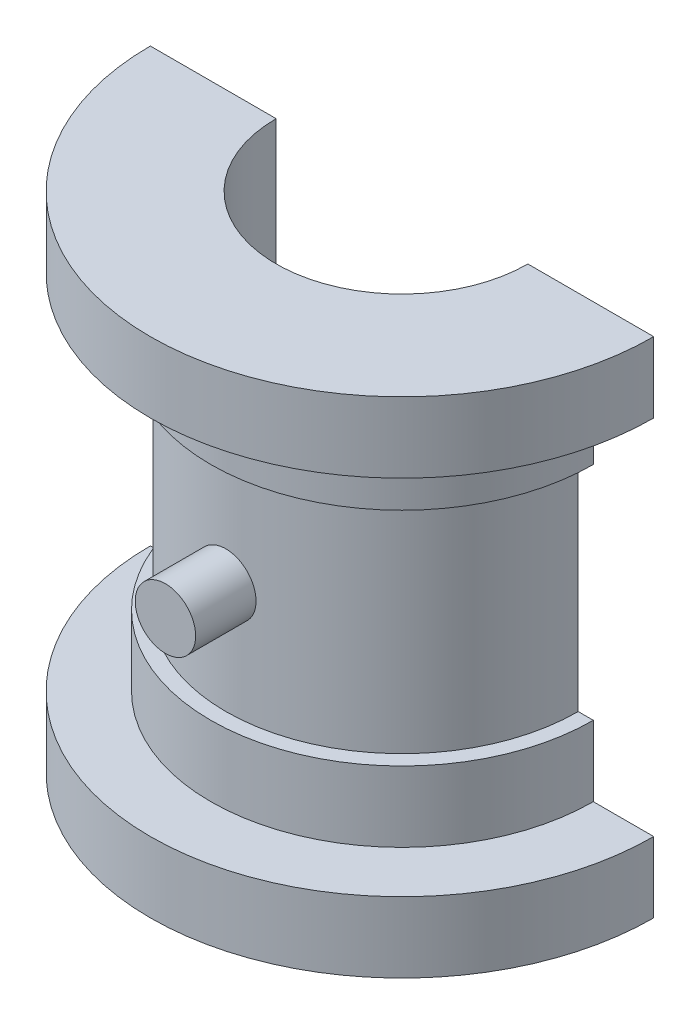
ISO-10303-21;
HEADER;
FILE_DESCRIPTION(('STEP AP214'),'2;1');
FILE_NAME('part.step','',(''),(''),'','','');
FILE_SCHEMA(('AUTOMOTIVE_DESIGN { 1 0 10303 214 1 1 1 1 }'));
ENDSEC;
DATA;
#1=APPLICATION_CONTEXT('core data for automotive mechanical design processes');
#2=APPLICATION_PROTOCOL_DEFINITION('international standard','automotive_design',2000,#1);
#3=PRODUCT_CONTEXT('',#1,'mechanical');
#4=PRODUCT('Part','Part','',(#3));
#5=PRODUCT_RELATED_PRODUCT_CATEGORY('part','',(#4));
#6=PRODUCT_DEFINITION_FORMATION('','',#4);
#7=PRODUCT_DEFINITION_CONTEXT('part definition',#1,'design');
#8=PRODUCT_DEFINITION('design','',#6,#7);
#9=PRODUCT_DEFINITION_SHAPE('','',#8);
#10=(LENGTH_UNIT() NAMED_UNIT(*) SI_UNIT(.MILLI.,.METRE.));
#11=(NAMED_UNIT(*) PLANE_ANGLE_UNIT() SI_UNIT($,.RADIAN.));
#12=(NAMED_UNIT(*) SI_UNIT($,.STERADIAN.) SOLID_ANGLE_UNIT());
#13=UNCERTAINTY_MEASURE_WITH_UNIT(LENGTH_MEASURE(1.E-05),#10,'distance_accuracy_value','');
#14=(GEOMETRIC_REPRESENTATION_CONTEXT(3) GLOBAL_UNCERTAINTY_ASSIGNED_CONTEXT((#13)) GLOBAL_UNIT_ASSIGNED_CONTEXT((#10,
#11,#12)) REPRESENTATION_CONTEXT('',''));
#15=CARTESIAN_POINT('',(0.,0.,0.));
#16=DIRECTION('',(0.,0.,1.));
#17=DIRECTION('',(1.,0.,0.));
#18=AXIS2_PLACEMENT_3D('',#15,#16,#17);
#19=CARTESIAN_POINT('',(0.,0.,23.5));
#20=DIRECTION('',(0.,0.,-1.));
#21=DIRECTION('',(-1.,0.,0.));
#22=AXIS2_PLACEMENT_3D('',#19,#20,#21);
#23=CYLINDRICAL_SURFACE('',#22,3.);
#24=CARTESIAN_POINT('',(0.,0.,23.5));
#25=DIRECTION('',(0.,0.,1.));
#26=DIRECTION('',(1.,0.,0.));
#27=AXIS2_PLACEMENT_3D('',#24,#25,#26);
#28=CIRCLE('',#27,3.);
#29=CARTESIAN_POINT('',(3.,0.,23.5));
#30=VERTEX_POINT('',#29);
#31=EDGE_CURVE('E11',#30,#30,#28,.T.);
#32=ORIENTED_EDGE('',*,*,#31,.F.);
#33=EDGE_LOOP('',(#32));
#34=FACE_BOUND('',#33,.T.);
#35=CARTESIAN_POINT('',(0.,0.,17.5));
#36=DIRECTION('',(0.,0.,1.));
#37=DIRECTION('',(1.,0.,0.));
#38=AXIS2_PLACEMENT_3D('',#35,#36,#37);
#39=CIRCLE('',#38,3.);
#40=CARTESIAN_POINT('',(3.,0.,17.5));
#41=VERTEX_POINT('',#40);
#42=EDGE_CURVE('E43',#41,#41,#39,.T.);
#43=ORIENTED_EDGE('',*,*,#42,.T.);
#44=EDGE_LOOP('',(#43));
#45=FACE_BOUND('',#44,.T.);
#46=ADVANCED_FACE('F40',(#34,#45),#23,.T.);
#47=CARTESIAN_POINT('',(0.,0.,23.5));
#48=DIRECTION('',(0.,0.,1.));
#49=DIRECTION('',(1.,0.,0.));
#50=AXIS2_PLACEMENT_3D('',#47,#48,#49);
#51=PLANE('',#50);
#52=ORIENTED_EDGE('',*,*,#31,.T.);
#53=EDGE_LOOP('',(#52));
#54=FACE_BOUND('',#53,.T.);
#55=ADVANCED_FACE('F55',(#54),#51,.T.);
#56=CARTESIAN_POINT('',(0.,0.,17.5));
#57=DIRECTION('',(0.,0.,1.));
#58=DIRECTION('',(1.,0.,0.));
#59=AXIS2_PLACEMENT_3D('',#56,#57,#58);
#60=PLANE('',#59);
#61=ORIENTED_EDGE('',*,*,#42,.F.);
#62=EDGE_LOOP('',(#61));
#63=FACE_BOUND('',#62,.T.);
#64=ADVANCED_FACE('F53',(#63),#60,.F.);
#65=CLOSED_SHELL('',(#46,#55,#64));
#66=MANIFOLD_SOLID_BREP('B2',#65);
#67=CARTESIAN_POINT('',(0.,26.2618296529968,0.));
#68=DIRECTION('',(0.,1.,0.));
#69=DIRECTION('',(0.,0.,1.));
#70=AXIS2_PLACEMENT_3D('',#67,#68,#69);
#71=CYLINDRICAL_SURFACE('',#70,19.);
#72=DIRECTION('',(0.,1.,0.));
#73=VECTOR('',#72,1.);
#74=CARTESIAN_POINT('',(-19.,26.2618296529968,0.));
#75=LINE('',#74,#73);
#76=CARTESIAN_POINT('',(-19.,11.,0.));
#77=VERTEX_POINT('',#76);
#78=CARTESIAN_POINT('',(-19.,18.,0.));
#79=VERTEX_POINT('',#78);
#80=EDGE_CURVE('E94',#77,#79,#75,.T.);
#81=ORIENTED_EDGE('',*,*,#80,.F.);
#82=CARTESIAN_POINT('',(0.,11.,0.));
#83=DIRECTION('',(0.,1.,0.));
#84=DIRECTION('',(0.,0.,1.));
#85=AXIS2_PLACEMENT_3D('',#82,#83,#84);
#86=CIRCLE('',#85,19.);
#87=CARTESIAN_POINT('',(19.,11.,0.));
#88=VERTEX_POINT('',#87);
#89=EDGE_CURVE('E191',#77,#88,#86,.T.);
#90=ORIENTED_EDGE('',*,*,#89,.T.);
#91=DIRECTION('',(0.,1.,0.));
#92=VECTOR('',#91,1.);
#93=CARTESIAN_POINT('',(19.,26.2618296529968,0.));
#94=LINE('',#93,#92);
#95=CARTESIAN_POINT('',(19.,18.,0.));
#96=VERTEX_POINT('',#95);
#97=EDGE_CURVE('E241',#96,#88,#94,.F.);
#98=ORIENTED_EDGE('',*,*,#97,.F.);
#99=CARTESIAN_POINT('',(0.,18.,0.));
#100=DIRECTION('',(0.,1.,0.));
#101=DIRECTION('',(0.,0.,1.));
#102=AXIS2_PLACEMENT_3D('',#99,#100,#101);
#103=CIRCLE('',#102,19.);
#104=EDGE_CURVE('E176',#79,#96,#103,.T.);
#105=ORIENTED_EDGE('',*,*,#104,.F.);
#106=EDGE_LOOP('',(#81,#90,#98,#105));
#107=FACE_BOUND('',#106,.T.);
#108=ADVANCED_FACE('F80',(#107),#71,.T.);
#109=CARTESIAN_POINT('',(19.,11.,0.));
#110=DIRECTION('',(0.,1.,0.));
#111=DIRECTION('',(0.,0.,1.));
#112=AXIS2_PLACEMENT_3D('',#109,#110,#111);
#113=PLANE('',#112);
#114=DIRECTION('',(-1.,0.,0.));
#115=VECTOR('',#114,1.);
#116=CARTESIAN_POINT('',(19.,11.,0.));
#117=LINE('',#116,#115);
#118=CARTESIAN_POINT('',(17.5,11.,0.));
#119=VERTEX_POINT('',#118);
#120=EDGE_CURVE('E101',#88,#119,#117,.T.);
#121=ORIENTED_EDGE('',*,*,#120,.F.);
#122=ORIENTED_EDGE('',*,*,#89,.F.);
#123=CARTESIAN_POINT('',(-17.5,11.,0.));
#124=VERTEX_POINT('',#123);
#125=EDGE_CURVE('E255',#124,#77,#117,.T.);
#126=ORIENTED_EDGE('',*,*,#125,.F.);
#127=CARTESIAN_POINT('',(0.,11.,0.));
#128=DIRECTION('',(0.,1.,0.));
#129=DIRECTION('',(0.,0.,1.));
#130=AXIS2_PLACEMENT_3D('',#127,#128,#129);
#131=CIRCLE('',#130,17.5);
#132=EDGE_CURVE('E192',#124,#119,#131,.T.);
#133=ORIENTED_EDGE('',*,*,#132,.T.);
#134=EDGE_LOOP('',(#121,#122,#126,#133));
#135=FACE_BOUND('',#134,.T.);
#136=ADVANCED_FACE('F290',(#135),#113,.F.);
#137=CARTESIAN_POINT('',(0.,26.2618296529968,0.));
#138=DIRECTION('',(0.,1.,0.));
#139=DIRECTION('',(0.,0.,1.));
#140=AXIS2_PLACEMENT_3D('',#137,#138,#139);
#141=CYLINDRICAL_SURFACE('',#140,17.5);
#142=DIRECTION('',(0.,1.,0.));
#143=VECTOR('',#142,1.);
#144=CARTESIAN_POINT('',(-17.5,26.2618296529968,0.));
#145=LINE('',#144,#143);
#146=CARTESIAN_POINT('',(-17.5,-11.,0.));
#147=VERTEX_POINT('',#146);
#148=EDGE_CURVE('E252',#147,#124,#145,.T.);
#149=ORIENTED_EDGE('',*,*,#148,.F.);
#150=CARTESIAN_POINT('',(0.,-11.,0.));
#151=DIRECTION('',(0.,1.,0.));
#152=DIRECTION('',(0.,0.,1.));
#153=AXIS2_PLACEMENT_3D('',#150,#151,#152);
#154=CIRCLE('',#153,17.5);
#155=CARTESIAN_POINT('',(17.5,-11.,0.));
#156=VERTEX_POINT('',#155);
#157=EDGE_CURVE('E195',#147,#156,#154,.T.);
#158=ORIENTED_EDGE('',*,*,#157,.T.);
#159=DIRECTION('',(0.,1.,0.));
#160=VECTOR('',#159,1.);
#161=CARTESIAN_POINT('',(17.5,26.2618296529968,0.));
#162=LINE('',#161,#160);
#163=EDGE_CURVE('E238',#119,#156,#162,.F.);
#164=ORIENTED_EDGE('',*,*,#163,.F.);
#165=ORIENTED_EDGE('',*,*,#132,.F.);
#166=EDGE_LOOP('',(#149,#158,#164,#165));
#167=FACE_BOUND('',#166,.T.);
#168=ADVANCED_FACE('F288',(#167),#141,.T.);
#169=CARTESIAN_POINT('',(19.,-11.,0.));
#170=DIRECTION('',(0.,-1.,0.));
#171=DIRECTION('',(0.,0.,-1.));
#172=AXIS2_PLACEMENT_3D('',#169,#170,#171);
#173=PLANE('',#172);
#174=DIRECTION('',(1.,0.,0.));
#175=VECTOR('',#174,1.);
#176=CARTESIAN_POINT('',(19.,-11.,0.));
#177=LINE('',#176,#175);
#178=CARTESIAN_POINT('',(-19.,-11.,0.));
#179=VERTEX_POINT('',#178);
#180=EDGE_CURVE('E249',#179,#147,#177,.T.);
#181=ORIENTED_EDGE('',*,*,#180,.F.);
#182=CARTESIAN_POINT('',(0.,-11.,0.));
#183=DIRECTION('',(0.,1.,0.));
#184=DIRECTION('',(0.,0.,1.));
#185=AXIS2_PLACEMENT_3D('',#182,#183,#184);
#186=CIRCLE('',#185,19.);
#187=CARTESIAN_POINT('',(19.,-11.,0.));
#188=VERTEX_POINT('',#187);
#189=EDGE_CURVE('E200',#179,#188,#186,.T.);
#190=ORIENTED_EDGE('',*,*,#189,.T.);
#191=EDGE_CURVE('E237',#156,#188,#177,.T.);
#192=ORIENTED_EDGE('',*,*,#191,.F.);
#193=ORIENTED_EDGE('',*,*,#157,.F.);
#194=EDGE_LOOP('',(#181,#190,#192,#193));
#195=FACE_BOUND('',#194,.T.);
#196=ADVANCED_FACE('F286',(#195),#173,.F.);
#197=CARTESIAN_POINT('',(0.,26.2618296529968,0.));
#198=DIRECTION('',(0.,1.,0.));
#199=DIRECTION('',(0.,0.,1.));
#200=AXIS2_PLACEMENT_3D('',#197,#198,#199);
#201=CYLINDRICAL_SURFACE('',#200,19.);
#202=DIRECTION('',(0.,1.,0.));
#203=VECTOR('',#202,1.);
#204=CARTESIAN_POINT('',(-19.,26.2618296529968,0.));
#205=LINE('',#204,#203);
#206=CARTESIAN_POINT('',(-19.,-18.,0.));
#207=VERTEX_POINT('',#206);
#208=EDGE_CURVE('E246',#207,#179,#205,.T.);
#209=ORIENTED_EDGE('',*,*,#208,.F.);
#210=CARTESIAN_POINT('',(0.,-18.,0.));
#211=DIRECTION('',(0.,1.,0.));
#212=DIRECTION('',(0.,0.,1.));
#213=AXIS2_PLACEMENT_3D('',#210,#211,#212);
#214=CIRCLE('',#213,19.);
#215=CARTESIAN_POINT('',(19.,-18.,0.));
#216=VERTEX_POINT('',#215);
#217=EDGE_CURVE('E203',#207,#216,#214,.T.);
#218=ORIENTED_EDGE('',*,*,#217,.T.);
#219=DIRECTION('',(0.,1.,0.));
#220=VECTOR('',#219,1.);
#221=CARTESIAN_POINT('',(19.,26.2618296529968,0.));
#222=LINE('',#221,#220);
#223=EDGE_CURVE('E234',#188,#216,#222,.F.);
#224=ORIENTED_EDGE('',*,*,#223,.F.);
#225=ORIENTED_EDGE('',*,*,#189,.F.);
#226=EDGE_LOOP('',(#209,#218,#224,#225));
#227=FACE_BOUND('',#226,.T.);
#228=ADVANCED_FACE('F281',(#227),#201,.T.);
#229=CARTESIAN_POINT('',(25.,-18.,0.));
#230=DIRECTION('',(0.,-1.,0.));
#231=DIRECTION('',(0.,0.,-1.));
#232=AXIS2_PLACEMENT_3D('',#229,#230,#231);
#233=PLANE('',#232);
#234=DIRECTION('',(1.,0.,0.));
#235=VECTOR('',#234,1.);
#236=CARTESIAN_POINT('',(25.,-18.,0.));
#237=LINE('',#236,#235);
#238=CARTESIAN_POINT('',(-25.,-18.,0.));
#239=VERTEX_POINT('',#238);
#240=EDGE_CURVE('E243',#239,#207,#237,.T.);
#241=ORIENTED_EDGE('',*,*,#240,.F.);
#242=CARTESIAN_POINT('',(0.,-18.,0.));
#243=DIRECTION('',(0.,1.,0.));
#244=DIRECTION('',(0.,0.,1.));
#245=AXIS2_PLACEMENT_3D('',#242,#243,#244);
#246=CIRCLE('',#245,25.);
#247=CARTESIAN_POINT('',(25.,-18.,0.));
#248=VERTEX_POINT('',#247);
#249=EDGE_CURVE('E206',#239,#248,#246,.T.);
#250=ORIENTED_EDGE('',*,*,#249,.T.);
#251=EDGE_CURVE('E233',#216,#248,#237,.T.);
#252=ORIENTED_EDGE('',*,*,#251,.F.);
#253=ORIENTED_EDGE('',*,*,#217,.F.);
#254=EDGE_LOOP('',(#241,#250,#252,#253));
#255=FACE_BOUND('',#254,.T.);
#256=ADVANCED_FACE('F279',(#255),#233,.F.);
#257=CARTESIAN_POINT('',(0.,26.2618296529968,0.));
#258=DIRECTION('',(0.,1.,0.));
#259=DIRECTION('',(0.,0.,1.));
#260=AXIS2_PLACEMENT_3D('',#257,#258,#259);
#261=CYLINDRICAL_SURFACE('',#260,25.);
#262=DIRECTION('',(0.,-1.,0.));
#263=VECTOR('',#262,1.);
#264=CARTESIAN_POINT('',(-25.,142.003175473055,0.));
#265=LINE('',#264,#263);
#266=CARTESIAN_POINT('',(-25.,-25.,0.));
#267=VERTEX_POINT('',#266);
#268=EDGE_CURVE('E186',#239,#267,#265,.T.);
#269=ORIENTED_EDGE('',*,*,#268,.T.);
#270=CARTESIAN_POINT('',(0.,-25.,0.));
#271=DIRECTION('',(0.,1.,0.));
#272=DIRECTION('',(0.,0.,1.));
#273=AXIS2_PLACEMENT_3D('',#270,#271,#272);
#274=CIRCLE('',#273,25.);
#275=CARTESIAN_POINT('',(25.,-25.,0.));
#276=VERTEX_POINT('',#275);
#277=EDGE_CURVE('E209',#267,#276,#274,.T.);
#278=ORIENTED_EDGE('',*,*,#277,.T.);
#279=DIRECTION('',(0.,-1.,0.));
#280=VECTOR('',#279,1.);
#281=CARTESIAN_POINT('',(25.,142.003175473055,0.));
#282=LINE('',#281,#280);
#283=EDGE_CURVE('E185',#248,#276,#282,.T.);
#284=ORIENTED_EDGE('',*,*,#283,.F.);
#285=ORIENTED_EDGE('',*,*,#249,.F.);
#286=EDGE_LOOP('',(#269,#278,#284,#285));
#287=FACE_BOUND('',#286,.T.);
#288=ADVANCED_FACE('F275',(#287),#261,.T.);
#289=CARTESIAN_POINT('',(12.5,-25.,0.));
#290=DIRECTION('',(0.,1.,0.));
#291=DIRECTION('',(0.,0.,1.));
#292=AXIS2_PLACEMENT_3D('',#289,#290,#291);
#293=PLANE('',#292);
#294=DIRECTION('',(-1.,0.,0.));
#295=VECTOR('',#294,1.);
#296=CARTESIAN_POINT('',(12.5,-25.,0.));
#297=LINE('',#296,#295);
#298=CARTESIAN_POINT('',(12.5,-25.,0.));
#299=VERTEX_POINT('',#298);
#300=EDGE_CURVE('E224',#276,#299,#297,.T.);
#301=ORIENTED_EDGE('',*,*,#300,.F.);
#302=ORIENTED_EDGE('',*,*,#277,.F.);
#303=CARTESIAN_POINT('',(-12.5,-25.,0.));
#304=VERTEX_POINT('',#303);
#305=EDGE_CURVE('E220',#304,#267,#297,.T.);
#306=ORIENTED_EDGE('',*,*,#305,.F.);
#307=CARTESIAN_POINT('',(0.,-25.,0.));
#308=DIRECTION('',(0.,1.,0.));
#309=DIRECTION('',(0.,0.,1.));
#310=AXIS2_PLACEMENT_3D('',#307,#308,#309);
#311=CIRCLE('',#310,12.5);
#312=EDGE_CURVE('E212',#304,#299,#311,.T.);
#313=ORIENTED_EDGE('',*,*,#312,.T.);
#314=EDGE_LOOP('',(#301,#302,#306,#313));
#315=FACE_BOUND('',#314,.T.);
#316=ADVANCED_FACE('F272',(#315),#293,.F.);
#317=CARTESIAN_POINT('',(0.,26.2618296529968,0.));
#318=DIRECTION('',(0.,1.,0.));
#319=DIRECTION('',(0.,0.,1.));
#320=AXIS2_PLACEMENT_3D('',#317,#318,#319);
#321=CYLINDRICAL_SURFACE('',#320,12.5);
#322=DIRECTION('',(0.,1.,0.));
#323=VECTOR('',#322,1.);
#324=CARTESIAN_POINT('',(-12.5,26.2618296529968,0.));
#325=LINE('',#324,#323);
#326=CARTESIAN_POINT('',(-12.5,25.,0.));
#327=VERTEX_POINT('',#326);
#328=EDGE_CURVE('E221',#327,#304,#325,.F.);
#329=ORIENTED_EDGE('',*,*,#328,.F.);
#330=CARTESIAN_POINT('',(0.,25.,0.));
#331=DIRECTION('',(0.,1.,0.));
#332=DIRECTION('',(0.,0.,1.));
#333=AXIS2_PLACEMENT_3D('',#330,#331,#332);
#334=CIRCLE('',#333,12.5);
#335=CARTESIAN_POINT('',(12.5,25.,0.));
#336=VERTEX_POINT('',#335);
#337=EDGE_CURVE('E215',#327,#336,#334,.T.);
#338=ORIENTED_EDGE('',*,*,#337,.T.);
#339=DIRECTION('',(0.,1.,0.));
#340=VECTOR('',#339,1.);
#341=CARTESIAN_POINT('',(12.5,26.2618296529968,0.));
#342=LINE('',#341,#340);
#343=EDGE_CURVE('E227',#299,#336,#342,.T.);
#344=ORIENTED_EDGE('',*,*,#343,.F.);
#345=ORIENTED_EDGE('',*,*,#312,.F.);
#346=EDGE_LOOP('',(#329,#338,#344,#345));
#347=FACE_BOUND('',#346,.T.);
#348=ADVANCED_FACE('F270',(#347),#321,.F.);
#349=CARTESIAN_POINT('',(12.5,25.,0.));
#350=DIRECTION('',(0.,-1.,0.));
#351=DIRECTION('',(0.,0.,-1.));
#352=AXIS2_PLACEMENT_3D('',#349,#350,#351);
#353=PLANE('',#352);
#354=DIRECTION('',(1.,0.,0.));
#355=VECTOR('',#354,1.);
#356=CARTESIAN_POINT('',(12.5,25.,0.));
#357=LINE('',#356,#355);
#358=CARTESIAN_POINT('',(-25.,25.,0.));
#359=VERTEX_POINT('',#358);
#360=EDGE_CURVE('E223',#359,#327,#357,.T.);
#361=ORIENTED_EDGE('',*,*,#360,.F.);
#362=CARTESIAN_POINT('',(0.,25.,0.));
#363=DIRECTION('',(0.,1.,0.));
#364=DIRECTION('',(0.,0.,1.));
#365=AXIS2_PLACEMENT_3D('',#362,#363,#364);
#366=CIRCLE('',#365,25.);
#367=CARTESIAN_POINT('',(25.,25.,0.));
#368=VERTEX_POINT('',#367);
#369=EDGE_CURVE('E175',#359,#368,#366,.T.);
#370=ORIENTED_EDGE('',*,*,#369,.T.);
#371=EDGE_CURVE('E230',#336,#368,#357,.T.);
#372=ORIENTED_EDGE('',*,*,#371,.F.);
#373=ORIENTED_EDGE('',*,*,#337,.F.);
#374=EDGE_LOOP('',(#361,#370,#372,#373));
#375=FACE_BOUND('',#374,.T.);
#376=ADVANCED_FACE('F264',(#375),#353,.F.);
#377=CARTESIAN_POINT('',(0.,26.2618296529968,0.));
#378=DIRECTION('',(0.,1.,0.));
#379=DIRECTION('',(0.,0.,1.));
#380=AXIS2_PLACEMENT_3D('',#377,#378,#379);
#381=CYLINDRICAL_SURFACE('',#380,25.);
#382=CARTESIAN_POINT('',(-25.,18.,0.));
#383=VERTEX_POINT('',#382);
#384=EDGE_CURVE('E180',#359,#383,#265,.T.);
#385=ORIENTED_EDGE('',*,*,#384,.T.);
#386=CARTESIAN_POINT('',(0.,18.,0.));
#387=DIRECTION('',(0.,1.,0.));
#388=DIRECTION('',(0.,0.,1.));
#389=AXIS2_PLACEMENT_3D('',#386,#387,#388);
#390=CIRCLE('',#389,25.);
#391=CARTESIAN_POINT('',(25.,18.,0.));
#392=VERTEX_POINT('',#391);
#393=EDGE_CURVE('E169',#383,#392,#390,.T.);
#394=ORIENTED_EDGE('',*,*,#393,.T.);
#395=EDGE_CURVE('E257',#368,#392,#282,.T.);
#396=ORIENTED_EDGE('',*,*,#395,.F.);
#397=ORIENTED_EDGE('',*,*,#369,.F.);
#398=EDGE_LOOP('',(#385,#394,#396,#397));
#399=FACE_BOUND('',#398,.T.);
#400=ADVANCED_FACE('F181',(#399),#381,.T.);
#401=CARTESIAN_POINT('',(25.,18.,0.));
#402=DIRECTION('',(0.,1.,0.));
#403=DIRECTION('',(0.,0.,1.));
#404=AXIS2_PLACEMENT_3D('',#401,#402,#403);
#405=PLANE('',#404);
#406=DIRECTION('',(-1.,0.,0.));
#407=VECTOR('',#406,1.);
#408=CARTESIAN_POINT('',(25.,18.,0.));
#409=LINE('',#408,#407);
#410=EDGE_CURVE('E38',#392,#96,#409,.T.);
#411=ORIENTED_EDGE('',*,*,#410,.F.);
#412=ORIENTED_EDGE('',*,*,#393,.F.);
#413=EDGE_CURVE('E83',#79,#383,#409,.T.);
#414=ORIENTED_EDGE('',*,*,#413,.F.);
#415=ORIENTED_EDGE('',*,*,#104,.T.);
#416=EDGE_LOOP('',(#411,#412,#414,#415));
#417=FACE_BOUND('',#416,.T.);
#418=ADVANCED_FACE('F171',(#417),#405,.F.);
#419=CARTESIAN_POINT('',(-25.,142.003175473055,0.));
#420=DIRECTION('',(0.,0.,-1.));
#421=DIRECTION('',(-1.,0.,0.));
#422=AXIS2_PLACEMENT_3D('',#419,#420,#421);
#423=PLANE('',#422);
#424=ORIENTED_EDGE('',*,*,#328,.T.);
#425=ORIENTED_EDGE('',*,*,#305,.T.);
#426=ORIENTED_EDGE('',*,*,#268,.F.);
#427=ORIENTED_EDGE('',*,*,#240,.T.);
#428=ORIENTED_EDGE('',*,*,#208,.T.);
#429=ORIENTED_EDGE('',*,*,#180,.T.);
#430=ORIENTED_EDGE('',*,*,#148,.T.);
#431=ORIENTED_EDGE('',*,*,#125,.T.);
#432=ORIENTED_EDGE('',*,*,#80,.T.);
#433=ORIENTED_EDGE('',*,*,#413,.T.);
#434=ORIENTED_EDGE('',*,*,#384,.F.);
#435=ORIENTED_EDGE('',*,*,#360,.T.);
#436=EDGE_LOOP('',(#424,#425,#426,#427,#428,#429,#430,#431,#432,#433,#434,#435));
#437=FACE_BOUND('',#436,.T.);
#438=ADVANCED_FACE('F189',(#437),#423,.T.);
#439=ORIENTED_EDGE('',*,*,#283,.T.);
#440=ORIENTED_EDGE('',*,*,#300,.T.);
#441=ORIENTED_EDGE('',*,*,#343,.T.);
#442=ORIENTED_EDGE('',*,*,#371,.T.);
#443=ORIENTED_EDGE('',*,*,#395,.T.);
#444=ORIENTED_EDGE('',*,*,#410,.T.);
#445=ORIENTED_EDGE('',*,*,#97,.T.);
#446=ORIENTED_EDGE('',*,*,#120,.T.);
#447=ORIENTED_EDGE('',*,*,#163,.T.);
#448=ORIENTED_EDGE('',*,*,#191,.T.);
#449=ORIENTED_EDGE('',*,*,#223,.T.);
#450=ORIENTED_EDGE('',*,*,#251,.T.);
#451=EDGE_LOOP('',(#439,#440,#441,#442,#443,#444,#445,#446,#447,#448,#449,#450));
#452=FACE_BOUND('',#451,.T.);
#453=ADVANCED_FACE('F262',(#452),#423,.T.);
#454=CLOSED_SHELL('',(#108,#136,#168,#196,#228,#256,#288,#316,#348,#376,#400,#418,#438,#453));
#455=MANIFOLD_SOLID_BREP('B6',#454);
#456=ADVANCED_BREP_SHAPE_REPRESENTATION('',(#18,#66,#455),#14);
#457=SHAPE_DEFINITION_REPRESENTATION(#9,#456);
ENDSEC;
END-ISO-10303-21;
